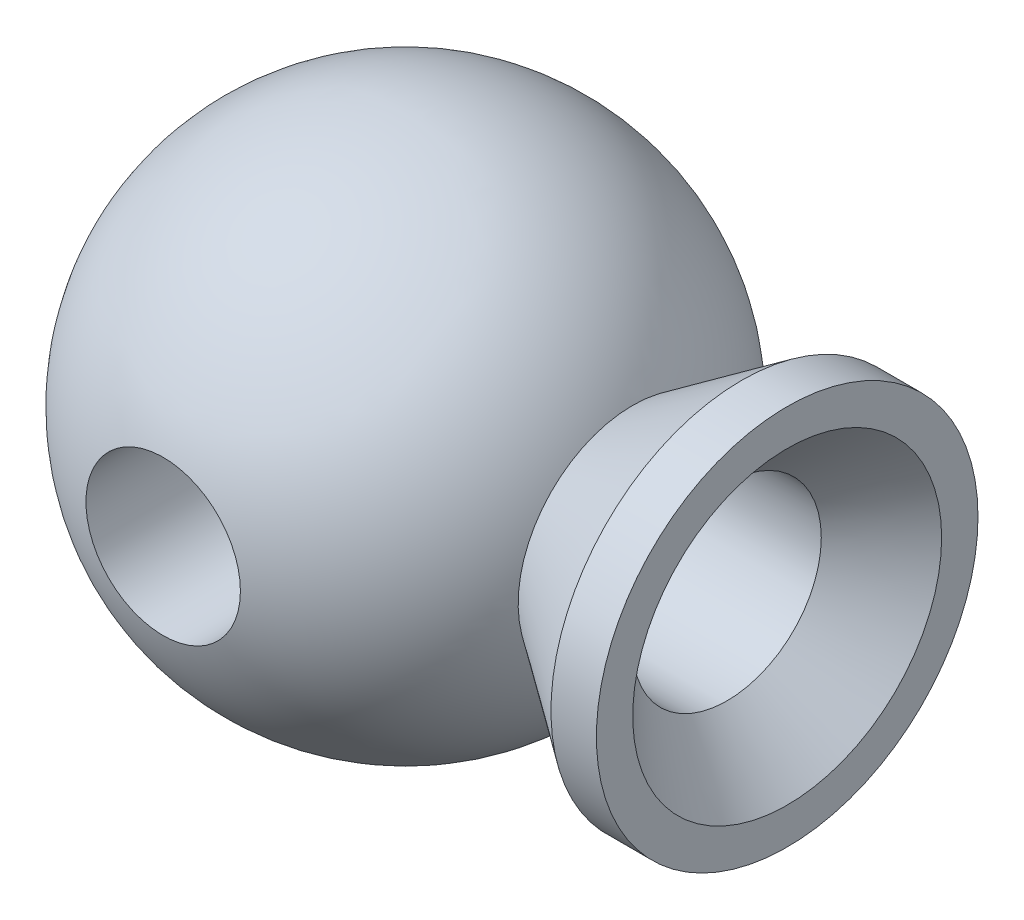
ISO-10303-21;
HEADER;
FILE_DESCRIPTION(('STEP AP214'),'2;1');
FILE_NAME('part.step','',(''),(''),'','','');
FILE_SCHEMA(('AUTOMOTIVE_DESIGN { 1 0 10303 214 1 1 1 1 }'));
ENDSEC;
DATA;
#1=APPLICATION_CONTEXT('core data for automotive mechanical design processes');
#2=APPLICATION_PROTOCOL_DEFINITION('international standard','automotive_design',2000,#1);
#3=PRODUCT_CONTEXT('',#1,'mechanical');
#4=PRODUCT('Part','Part','',(#3));
#5=PRODUCT_RELATED_PRODUCT_CATEGORY('part','',(#4));
#6=PRODUCT_DEFINITION_FORMATION('','',#4);
#7=PRODUCT_DEFINITION_CONTEXT('part definition',#1,'design');
#8=PRODUCT_DEFINITION('design','',#6,#7);
#9=PRODUCT_DEFINITION_SHAPE('','',#8);
#10=(LENGTH_UNIT() NAMED_UNIT(*) SI_UNIT(.MILLI.,.METRE.));
#11=(NAMED_UNIT(*) PLANE_ANGLE_UNIT() SI_UNIT($,.RADIAN.));
#12=(NAMED_UNIT(*) SI_UNIT($,.STERADIAN.) SOLID_ANGLE_UNIT());
#13=UNCERTAINTY_MEASURE_WITH_UNIT(LENGTH_MEASURE(1.E-05),#10,'distance_accuracy_value','');
#14=(GEOMETRIC_REPRESENTATION_CONTEXT(3) GLOBAL_UNCERTAINTY_ASSIGNED_CONTEXT((#13)) GLOBAL_UNIT_ASSIGNED_CONTEXT((#10,
#11,#12)) REPRESENTATION_CONTEXT('',''));
#15=CARTESIAN_POINT('',(0.,0.,0.));
#16=DIRECTION('',(0.,0.,1.));
#17=DIRECTION('',(1.,0.,0.));
#18=AXIS2_PLACEMENT_3D('',#15,#16,#17);
#19=CARTESIAN_POINT('',(19.9999999999818,0.,0.));
#20=DIRECTION('',(1.,0.,0.));
#21=DIRECTION('',(0.,0.,-1.));
#22=AXIS2_PLACEMENT_3D('',#19,#20,#21);
#23=CONICAL_SURFACE('',#22,10.3760000000079,1.02974425867021);
#24=CARTESIAN_POINT('',(13.7654702169243,0.,1.13686837721616E-10));
#25=VERTEX_POINT('',#24);
#26=VERTEX_LOOP('',#25);
#27=FACE_BOUND('',#26,.T.);
#28=CARTESIAN_POINT('',(20.,0.,0.));
#29=DIRECTION('',(1.,0.,0.));
#30=DIRECTION('',(0.,0.,-1.));
#31=AXIS2_PLACEMENT_3D('',#28,#29,#30);
#32=CIRCLE('',#31,10.376);
#33=CARTESIAN_POINT('',(20.,0.,-10.376));
#34=VERTEX_POINT('',#33);
#35=EDGE_CURVE('E37',#34,#34,#32,.T.);
#36=ORIENTED_EDGE('',*,*,#35,.T.);
#37=EDGE_LOOP('',(#36));
#38=FACE_BOUND('',#37,.T.);
#39=ADVANCED_FACE('F17',(#27,#38),#23,.F.);
#40=CARTESIAN_POINT('',(31.,0.,0.));
#41=DIRECTION('',(1.,0.,0.));
#42=DIRECTION('',(0.,0.,-1.));
#43=AXIS2_PLACEMENT_3D('',#40,#41,#42);
#44=CYLINDRICAL_SURFACE('',#43,10.376);
#45=ORIENTED_EDGE('',*,*,#35,.F.);
#46=EDGE_LOOP('',(#45));
#47=FACE_BOUND('',#46,.T.);
#48=CARTESIAN_POINT('',(35.3760000000084,0.,0.));
#49=DIRECTION('',(1.,0.,0.));
#50=DIRECTION('',(0.,0.,-1.));
#51=AXIS2_PLACEMENT_3D('',#48,#49,#50);
#52=CIRCLE('',#51,10.3759999999915);
#53=CARTESIAN_POINT('',(35.3760000000084,0.,-10.3759999999915));
#54=VERTEX_POINT('',#53);
#55=EDGE_CURVE('E39',#54,#54,#52,.T.);
#56=ORIENTED_EDGE('',*,*,#55,.T.);
#57=EDGE_LOOP('',(#56));
#58=FACE_BOUND('',#57,.T.);
#59=ADVANCED_FACE('F34',(#47,#58),#44,.F.);
#60=CARTESIAN_POINT('',(41.9999999999916,0.,0.));
#61=DIRECTION('',(1.,0.,0.));
#62=DIRECTION('',(0.,0.,-1.));
#63=AXIS2_PLACEMENT_3D('',#60,#61,#62);
#64=CONICAL_SURFACE('',#63,17.0000000000085,0.7853981634);
#65=ORIENTED_EDGE('',*,*,#55,.F.);
#66=EDGE_LOOP('',(#65));
#67=FACE_BOUND('',#66,.T.);
#68=CARTESIAN_POINT('',(41.9999999999916,0.,0.));
#69=DIRECTION('',(1.,0.,0.));
#70=DIRECTION('',(0.,0.,-1.));
#71=AXIS2_PLACEMENT_3D('',#68,#69,#70);
#72=CIRCLE('',#71,17.0000000000085);
#73=CARTESIAN_POINT('',(41.9999999999916,0.,-17.0000000000085));
#74=VERTEX_POINT('',#73);
#75=EDGE_CURVE('E20',#74,#74,#72,.F.);
#76=ORIENTED_EDGE('',*,*,#75,.F.);
#77=EDGE_LOOP('',(#76));
#78=FACE_BOUND('',#77,.T.);
#79=ADVANCED_FACE('F65',(#67,#78),#64,.F.);
#80=CARTESIAN_POINT('',(42.,0.,0.));
#81=DIRECTION('',(1.,0.,0.));
#82=DIRECTION('',(0.,0.,-1.));
#83=AXIS2_PLACEMENT_3D('',#80,#81,#82);
#84=PLANE('',#83);
#85=ORIENTED_EDGE('',*,*,#75,.T.);
#86=EDGE_LOOP('',(#85));
#87=FACE_BOUND('',#86,.T.);
#88=CARTESIAN_POINT('',(42.,0.,0.));
#89=DIRECTION('',(1.,0.,0.));
#90=DIRECTION('',(0.,0.,-1.));
#91=AXIS2_PLACEMENT_3D('',#88,#89,#90);
#92=CIRCLE('',#91,21.);
#93=CARTESIAN_POINT('',(42.,0.,-21.));
#94=VERTEX_POINT('',#93);
#95=EDGE_CURVE('E53',#94,#94,#92,.F.);
#96=ORIENTED_EDGE('',*,*,#95,.F.);
#97=EDGE_LOOP('',(#96));
#98=FACE_BOUND('',#97,.T.);
#99=ADVANCED_FACE('F62',(#87,#98),#84,.T.);
#100=CARTESIAN_POINT('',(39.5,0.,0.));
#101=DIRECTION('',(1.,0.,0.));
#102=DIRECTION('',(0.,0.,-1.));
#103=AXIS2_PLACEMENT_3D('',#100,#101,#102);
#104=CYLINDRICAL_SURFACE('',#103,21.);
#105=ORIENTED_EDGE('',*,*,#95,.T.);
#106=EDGE_LOOP('',(#105));
#107=FACE_BOUND('',#106,.T.);
#108=CARTESIAN_POINT('',(36.9999999999917,0.,0.));
#109=DIRECTION('',(1.,0.,0.));
#110=DIRECTION('',(0.,1.,0.));
#111=AXIS2_PLACEMENT_3D('',#108,#109,#110);
#112=CIRCLE('',#111,21.0000000000119);
#113=CARTESIAN_POINT('',(36.9999999999917,21.0000000000119,0.));
#114=VERTEX_POINT('',#113);
#115=EDGE_CURVE('E52',#114,#114,#112,.F.);
#116=ORIENTED_EDGE('',*,*,#115,.F.);
#117=EDGE_LOOP('',(#116));
#118=FACE_BOUND('',#117,.T.);
#119=ADVANCED_FACE('F74',(#107,#118),#104,.T.);
#120=CARTESIAN_POINT('',(0.,0.,0.));
#121=DIRECTION('',(0.,0.,1.));
#122=DIRECTION('',(1.,0.,0.));
#123=AXIS2_PLACEMENT_3D('',#120,#121,#122);
#124=CYLINDRICAL_SURFACE('',#123,8.5);
#125=CARTESIAN_POINT('',(0.,0.,-26.6786431439082));
#126=DIRECTION('',(0.,0.,1.));
#127=DIRECTION('',(1.,0.,0.));
#128=AXIS2_PLACEMENT_3D('',#125,#126,#127);
#129=CIRCLE('',#128,8.5);
#130=CARTESIAN_POINT('',(8.5,0.,-26.6786431439082));
#131=VERTEX_POINT('',#130);
#132=EDGE_CURVE('E26',#131,#131,#129,.T.);
#133=ORIENTED_EDGE('',*,*,#132,.F.);
#134=EDGE_LOOP('',(#133));
#135=FACE_BOUND('',#134,.T.);
#136=CARTESIAN_POINT('',(0.,0.,26.6786431439082));
#137=DIRECTION('',(0.,0.,1.));
#138=DIRECTION('',(1.,0.,0.));
#139=AXIS2_PLACEMENT_3D('',#136,#137,#138);
#140=CIRCLE('',#139,8.5);
#141=CARTESIAN_POINT('',(8.5,0.,26.6786431439082));
#142=VERTEX_POINT('',#141);
#143=EDGE_CURVE('E50',#142,#142,#140,.F.);
#144=ORIENTED_EDGE('',*,*,#143,.F.);
#145=EDGE_LOOP('',(#144));
#146=FACE_BOUND('',#145,.T.);
#147=ADVANCED_FACE('F84',(#135,#146),#124,.F.);
#148=CARTESIAN_POINT('',(36.9999999999917,0.,0.));
#149=DIRECTION('',(1.,0.,0.));
#150=DIRECTION('',(0.,0.,-1.));
#151=AXIS2_PLACEMENT_3D('',#148,#149,#150);
#152=CONICAL_SURFACE('',#151,21.0000000000119,0.61019331552824);
#153=ORIENTED_EDGE('',*,*,#115,.T.);
#154=EDGE_LOOP('',(#153));
#155=FACE_BOUND('',#154,.T.);
#156=CARTESIAN_POINT('',(25.,0.,0.));
#157=DIRECTION('',(1.,0.,0.));
#158=DIRECTION('',(0.,1.,0.));
#159=AXIS2_PLACEMENT_3D('',#156,#157,#158);
#160=CIRCLE('',#159,12.6095202129185);
#161=CARTESIAN_POINT('',(25.,12.6095202129185,0.));
#162=VERTEX_POINT('',#161);
#163=EDGE_CURVE('E11',#162,#162,#160,.F.);
#164=ORIENTED_EDGE('',*,*,#163,.F.);
#165=EDGE_LOOP('',(#164));
#166=FACE_BOUND('',#165,.T.);
#167=ADVANCED_FACE('F79',(#155,#166),#152,.T.);
#168=CARTESIAN_POINT('',(0.,0.,0.));
#169=DIRECTION('',(1.,0.,0.));
#170=DIRECTION('',(0.,1.,0.));
#171=AXIS2_PLACEMENT_3D('',#168,#169,#170);
#172=SPHERICAL_SURFACE('',#171,28.);
#173=CARTESIAN_POINT('',(-28.,0.,0.));
#174=VERTEX_POINT('',#173);
#175=VERTEX_LOOP('',#174);
#176=FACE_BOUND('',#175,.T.);
#177=ORIENTED_EDGE('',*,*,#163,.T.);
#178=EDGE_LOOP('',(#177));
#179=FACE_BOUND('',#178,.T.);
#180=ORIENTED_EDGE('',*,*,#132,.T.);
#181=EDGE_LOOP('',(#180));
#182=FACE_BOUND('',#181,.T.);
#183=ORIENTED_EDGE('',*,*,#143,.T.);
#184=EDGE_LOOP('',(#183));
#185=FACE_BOUND('',#184,.T.);
#186=ADVANCED_FACE('F77',(#176,#179,#182,#185),#172,.T.);
#187=CLOSED_SHELL('',(#39,#59,#79,#99,#119,#147,#167,#186));
#188=MANIFOLD_SOLID_BREP('B1',#187);
#189=ADVANCED_BREP_SHAPE_REPRESENTATION('',(#18,#188),#14);
#190=SHAPE_DEFINITION_REPRESENTATION(#9,#189);
ENDSEC;
END-ISO-10303-21;
